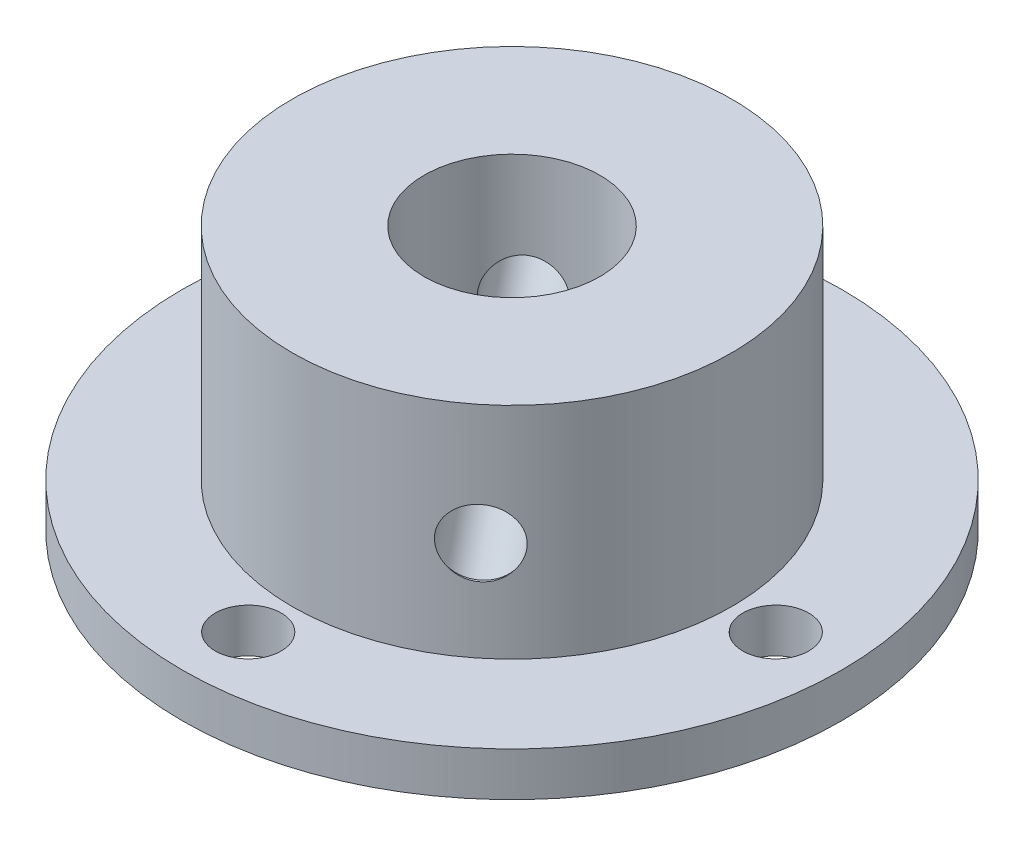
ISO-10303-21;
HEADER;
FILE_DESCRIPTION(('STEP AP214'),'2;1');
FILE_NAME('part.step','',(''),(''),'','','');
FILE_SCHEMA(('AUTOMOTIVE_DESIGN { 1 0 10303 214 1 1 1 1 }'));
ENDSEC;
DATA;
#1=APPLICATION_CONTEXT('core data for automotive mechanical design processes');
#2=APPLICATION_PROTOCOL_DEFINITION('international standard','automotive_design',2000,#1);
#3=PRODUCT_CONTEXT('',#1,'mechanical');
#4=PRODUCT('Part','Part','',(#3));
#5=PRODUCT_RELATED_PRODUCT_CATEGORY('part','',(#4));
#6=PRODUCT_DEFINITION_FORMATION('','',#4);
#7=PRODUCT_DEFINITION_CONTEXT('part definition',#1,'design');
#8=PRODUCT_DEFINITION('design','',#6,#7);
#9=PRODUCT_DEFINITION_SHAPE('','',#8);
#10=(LENGTH_UNIT() NAMED_UNIT(*) SI_UNIT(.MILLI.,.METRE.));
#11=(NAMED_UNIT(*) PLANE_ANGLE_UNIT() SI_UNIT($,.RADIAN.));
#12=(NAMED_UNIT(*) SI_UNIT($,.STERADIAN.) SOLID_ANGLE_UNIT());
#13=UNCERTAINTY_MEASURE_WITH_UNIT(LENGTH_MEASURE(1.E-05),#10,'distance_accuracy_value','');
#14=(GEOMETRIC_REPRESENTATION_CONTEXT(3) GLOBAL_UNCERTAINTY_ASSIGNED_CONTEXT((#13)) GLOBAL_UNIT_ASSIGNED_CONTEXT((#10,
#11,#12)) REPRESENTATION_CONTEXT('',''));
#15=CARTESIAN_POINT('',(0.,0.,0.));
#16=DIRECTION('',(0.,0.,1.));
#17=DIRECTION('',(1.,0.,0.));
#18=AXIS2_PLACEMENT_3D('',#15,#16,#17);
#19=CARTESIAN_POINT('',(0.,12.,0.));
#20=DIRECTION('',(0.,-1.,0.));
#21=DIRECTION('',(0.,0.,-1.));
#22=AXIS2_PLACEMENT_3D('',#19,#20,#21);
#23=CYLINDRICAL_SURFACE('',#22,10.);
#24=CARTESIAN_POINT('',(0.,2.,0.));
#25=DIRECTION('',(0.,1.,0.));
#26=DIRECTION('',(0.,0.,1.));
#27=AXIS2_PLACEMENT_3D('',#24,#25,#26);
#28=CIRCLE('',#27,10.);
#29=CARTESIAN_POINT('',(0.,2.,10.));
#30=VERTEX_POINT('',#29);
#31=EDGE_CURVE('E71',#30,#30,#28,.T.);
#32=ORIENTED_EDGE('',*,*,#31,.T.);
#33=EDGE_LOOP('',(#32));
#34=FACE_BOUND('',#33,.T.);
#35=CARTESIAN_POINT('',(0.,12.,0.));
#36=DIRECTION('',(0.,1.,0.));
#37=DIRECTION('',(0.,0.,1.));
#38=AXIS2_PLACEMENT_3D('',#35,#36,#37);
#39=CIRCLE('',#38,10.);
#40=CARTESIAN_POINT('',(0.,12.,10.));
#41=VERTEX_POINT('',#40);
#42=EDGE_CURVE('E159',#41,#41,#39,.T.);
#43=ORIENTED_EDGE('',*,*,#42,.F.);
#44=EDGE_LOOP('',(#43));
#45=FACE_BOUND('',#44,.T.);
#46=CARTESIAN_POINT('',(-5.08307461118374,6.53635540286175,-8.61175664409645));
#47=CARTESIAN_POINT('',(-5.08307817694966,6.6201009721517,-8.61175554427292));
#48=CARTESIAN_POINT('',(-5.08920908518111,6.70389515361246,-8.60814486953633));
#49=CARTESIAN_POINT('',(-5.11350770711867,6.86914071774488,-8.59373206617742));
#50=CARTESIAN_POINT('',(-5.13168716138509,6.95058973434176,-8.58292292304471));
#51=CARTESIAN_POINT('',(-5.17935967412099,7.10872915830865,-8.5542388362275));
#52=CARTESIAN_POINT('',(-5.2088440497765,7.18542316540391,-8.5363693149893));
#53=CARTESIAN_POINT('',(-5.27801574873614,7.33198243363383,-8.49377371345827));
#54=CARTESIAN_POINT('',(-5.31770166737011,7.40184863307605,-8.46904857709149));
#55=CARTESIAN_POINT('',(-5.40617635215064,7.53333921961609,-8.41284824317796));
#56=CARTESIAN_POINT('',(-5.45502825770332,7.59490101626849,-8.38132598458543));
#57=CARTESIAN_POINT('',(-5.55995514169737,7.70749288851725,-8.31209010424288));
#58=CARTESIAN_POINT('',(-5.61603051702298,7.75852238502874,-8.27437614226643));
#59=CARTESIAN_POINT('',(-5.7338163267514,7.84883203455311,-8.19319734820836));
#60=CARTESIAN_POINT('',(-5.79555254319987,7.88805455318421,-8.14970575366559));
#61=CARTESIAN_POINT('',(-5.92240711349197,7.95326700166993,-8.05799061214833));
#62=CARTESIAN_POINT('',(-5.98752528843069,7.97925763070464,-8.00976731536015));
#63=CARTESIAN_POINT('',(-6.11858051737623,8.01707879139259,-7.91010085779344));
#64=CARTESIAN_POINT('',(-6.18450775809609,8.02901412924891,-7.85868457787018));
#65=CARTESIAN_POINT('',(-6.31566310091543,8.03871133768665,-7.75367361991013));
#66=CARTESIAN_POINT('',(-6.3808912416786,8.03647399618144,-7.70007906313664));
#67=CARTESIAN_POINT('',(-6.50826793812144,8.01797206509932,-7.59271584279589));
#68=CARTESIAN_POINT('',(-6.57043701292343,8.00182023107027,-7.53895203110658));
#69=CARTESIAN_POINT('',(-6.69062787613971,7.95612479653918,-7.43249272246035));
#70=CARTESIAN_POINT('',(-6.74864955776677,7.92658085136031,-7.37979725303614));
#71=CARTESIAN_POINT('',(-6.85936753591646,7.85482440594466,-7.27700563527474));
#72=CARTESIAN_POINT('',(-6.91204287207897,7.81256443775301,-7.22692006601636));
#73=CARTESIAN_POINT('',(-7.01067024132053,7.71661020919177,-7.13128523845485));
#74=CARTESIAN_POINT('',(-7.05662183149915,7.66291519615489,-7.08573627904617));
#75=CARTESIAN_POINT('',(-7.14129629964028,7.54498695403516,-7.000395952245));
#76=CARTESIAN_POINT('',(-7.1799436431866,7.48065528089164,-6.96066561271789));
#77=CARTESIAN_POINT('',(-7.24870285143194,7.34361432573802,-6.8890333132094));
#78=CARTESIAN_POINT('',(-7.27881466356881,7.27090499214183,-6.85713140143595));
#79=CARTESIAN_POINT('',(-7.3299641671711,7.11907143992111,-6.80242866052988));
#80=CARTESIAN_POINT('',(-7.35099477303497,7.03994226919936,-6.77963493908389));
#81=CARTESIAN_POINT('',(-7.38355563650666,6.87757014771436,-6.74415980358345));
#82=CARTESIAN_POINT('',(-7.39508656366732,6.794327487315,-6.73147767684934));
#83=CARTESIAN_POINT('',(-7.40836949807466,6.62695531328427,-6.71685636897489));
#84=CARTESIAN_POINT('',(-7.41021520036589,6.54284221466022,-6.71481425750131));
#85=CARTESIAN_POINT('',(-7.40434623876113,6.37536120804442,-6.72128522795462));
#86=CARTESIAN_POINT('',(-7.3966318715137,6.29199327701099,-6.72979798236446));
#87=CARTESIAN_POINT('',(-7.37184841925341,6.12879558489612,-6.75693586817829));
#88=CARTESIAN_POINT('',(-7.35482636781345,6.04895019792015,-6.7755101523046));
#89=CARTESIAN_POINT('',(-7.31176689133334,5.89457131081315,-6.82195439734634));
#90=CARTESIAN_POINT('',(-7.28572902106105,5.82003807323356,-6.84982481733446));
#91=CARTESIAN_POINT('',(-7.22487676802852,5.67778214252671,-6.91397987589901));
#92=CARTESIAN_POINT('',(-7.18999777800768,5.61011495558194,-6.95032628991888));
#93=CARTESIAN_POINT('',(-7.11220894186605,5.48408254298795,-7.02990557314537));
#94=CARTESIAN_POINT('',(-7.06929864162603,5.4257178436806,-7.0731388317384));
#95=CARTESIAN_POINT('',(-6.97589487664977,5.31945279622817,-7.1652788890458));
#96=CARTESIAN_POINT('',(-6.9253412164699,5.27164367461928,-7.21422995217821));
#97=CARTESIAN_POINT('',(-6.81800544052381,5.18848249759911,-7.31575362208531));
#98=CARTESIAN_POINT('',(-6.76122349520676,5.15313010139673,-7.36832612973747));
#99=CARTESIAN_POINT('',(-6.64299351483298,5.09603166037373,-7.47508878985073));
#100=CARTESIAN_POINT('',(-6.58156352936914,5.0742357357834,-7.52927223426415));
#101=CARTESIAN_POINT('',(-6.45544605324106,5.04470752332428,-7.6376780572068));
#102=CARTESIAN_POINT('',(-6.39075877801112,5.03697430661261,-7.69190043292793));
#103=CARTESIAN_POINT('',(-6.26058583877584,5.03581369831235,-7.79820867084422));
#104=CARTESIAN_POINT('',(-6.19511423058082,5.04224672198478,-7.85031027323895));
#105=CARTESIAN_POINT('',(-6.0646738430679,5.06893679128251,-7.95151229219634));
#106=CARTESIAN_POINT('',(-5.9997050621416,5.08919379267032,-8.00061271836237));
#107=CARTESIAN_POINT('',(-5.87230143312781,5.14290727843199,-8.09458724222939));
#108=CARTESIAN_POINT('',(-5.80986476650116,5.17635409800069,-8.13946440475914));
#109=CARTESIAN_POINT('',(-5.68943388677001,5.2554828908449,-8.22409665284671));
#110=CARTESIAN_POINT('',(-5.63143981797108,5.3011652613421,-8.26385157205111));
#111=CARTESIAN_POINT('',(-5.52125283423965,5.40397310169093,-8.33787867274368));
#112=CARTESIAN_POINT('',(-5.46911926768605,5.4612016286781,-8.37209608115796));
#113=CARTESIAN_POINT('',(-5.37304939014834,5.58526047594223,-8.43407477360833));
#114=CARTESIAN_POINT('',(-5.32911500599916,5.6520930466861,-8.46183454045419));
#115=CARTESIAN_POINT('',(-5.25079932419697,5.79390438609429,-8.5106553449002));
#116=CARTESIAN_POINT('',(-5.21647309486782,5.86892681988358,-8.53167786421394));
#117=CARTESIAN_POINT('',(-5.15902763803963,6.02465217962505,-8.56653796602723));
#118=CARTESIAN_POINT('',(-5.1358967809357,6.10534911071958,-8.58038300546608));
#119=CARTESIAN_POINT('',(-5.10696599017329,6.24473283911823,-8.59762058289235));
#120=CARTESIAN_POINT('',(-5.09802412738678,6.30255879978603,-8.60291802852702));
#121=CARTESIAN_POINT('',(-5.08607722726613,6.4190336945961,-8.60998642154683));
#122=CARTESIAN_POINT('',(-5.08307211298093,6.47768261806137,-8.61175741464121));
#123=CARTESIAN_POINT('',(-5.08307461118374,6.53635540286175,-8.61175664409645));
#124=B_SPLINE_CURVE_WITH_KNOTS('',3,(#46,#47,#48,#49,#50,#51,#52,#53,#54,#55,#56,#57,#58,#59,
#60,#61,#62,#63,#64,#65,#66,#67,#68,#69,#70,#71,#72,#73,#74,#75,#76,#77,#78,#79,#80,#81,#82,#83,
#84,#85,#86,#87,#88,#89,#90,#91,#92,#93,#94,#95,#96,#97,#98,#99,#100,#101,#102,#103,#104,#105,
#106,#107,#108,#109,#110,#111,#112,#113,#114,#115,#116,#117,#118,#119,#120,#121,#122,#123),
.UNSPECIFIED.,.T.,.F.,(4,2,2,2,2,2,2,2,2,2,2,2,2,2,2,2,2,2,2,2,2,2,2,2,2,2,2,2,2,2,2,2,2,2,2,2,
2,2,4),(0.,0.251022251804866,0.502289469561801,0.753364085335673,1.00440414866132,
1.25724158649107,1.51009292207817,1.76415922105782,2.018212093645,2.27035832534396,
2.52249053939373,2.77259862515727,3.02271314839401,3.27377316386453,3.52484970949271,
3.77839544666269,4.03194274514349,4.28568751773138,4.5394144044434,4.79068214603743,
5.04194209099917,5.29194394807373,5.54195815286116,5.79385486001301,6.045765814618,
6.29977537753515,6.55377799071853,6.80684040891089,7.05988611170472,7.31044963622325,
7.56101235892822,7.81139182257832,8.06177941567105,8.31450950010968,8.56729890236861,
8.8215087882493,9.07545403445562,9.25132441891611,9.42719252376191),.UNSPECIFIED.);
#125=CARTESIAN_POINT('',(-5.08307461118374,6.53635540286175,-8.61175664409645));
#126=VERTEX_POINT('',#125);
#127=EDGE_CURVE('E75',#126,#126,#124,.T.);
#128=ORIENTED_EDGE('',*,*,#127,.T.);
#129=EDGE_LOOP('',(#128));
#130=FACE_BOUND('',#129,.T.);
#131=CARTESIAN_POINT('',(7.37151402092131,6.21177102222402,6.75727615532772));
#132=CARTESIAN_POINT('',(7.36507224797421,6.1671708958185,6.76430082265236));
#133=CARTESIAN_POINT('',(7.35729875582511,6.12301460371118,6.77276362068769));
#134=CARTESIAN_POINT('',(7.33910536300391,6.03588264113441,6.7924752633788));
#135=CARTESIAN_POINT('',(7.32868532767352,5.99290703086235,6.8037242497974));
#136=CARTESIAN_POINT('',(7.29351107732418,5.86630160868009,6.84148279595168));
#137=CARTESIAN_POINT('',(7.26482673901222,5.78488177286319,6.87202172024157));
#138=CARTESIAN_POINT('',(7.19900318386284,5.63429087673747,6.94092981271095));
#139=CARTESIAN_POINT('',(7.16230666175433,5.56473166422671,6.97888081043229));
#140=CARTESIAN_POINT('',(7.08039861875751,5.43566173346627,7.06196483258239));
#141=CARTESIAN_POINT('',(7.03519174691422,5.37614556239625,7.10709393366963));
#142=CARTESIAN_POINT('',(6.93801104648648,5.27007289675922,7.20198030703435));
#143=CARTESIAN_POINT('',(6.88617862452998,5.22329606776674,7.25163595602069));
#144=CARTESIAN_POINT('',(6.77621311128364,5.14284642930725,7.35449467666009));
#145=CARTESIAN_POINT('',(6.71808017084464,5.10917330619191,7.4076976633689));
#146=CARTESIAN_POINT('',(6.59902930462944,5.05706788537164,7.51391762530562));
#147=CARTESIAN_POINT('',(6.53827094206705,5.03816081774315,7.56688060511119));
#148=CARTESIAN_POINT('',(6.41389410032711,5.01443411606951,7.67258856933366));
#149=CARTESIAN_POINT('',(6.35027636295317,5.00961084945915,7.725333606458));
#150=CARTESIAN_POINT('',(6.22382270640697,5.01415953822926,7.82754514363739));
#151=CARTESIAN_POINT('',(6.16101312025166,5.02314620075932,7.87706187576541));
#152=CARTESIAN_POINT('',(6.03631970753792,5.05428547156036,7.97301925616255));
#153=CARTESIAN_POINT('',(5.97443589307006,5.07643825162706,8.01945986428463));
#154=CARTESIAN_POINT('',(5.85337737349311,5.13319210484075,8.10824404412226));
#155=CARTESIAN_POINT('',(5.79420625965987,5.167809171534,8.15058226286916));
#156=CARTESIAN_POINT('',(5.68042229280831,5.24837691540968,8.23028766479193));
#157=CARTESIAN_POINT('',(5.62580966496562,5.29432815202344,8.26765460245542));
#158=CARTESIAN_POINT('',(5.52130151859243,5.39762729886884,8.33782387917883));
#159=CARTESIAN_POINT('',(5.4715800152586,5.45525729001235,8.3704698674973));
#160=CARTESIAN_POINT('',(5.38013364614845,5.57941446375165,8.42953937715177));
#161=CARTESIAN_POINT('',(5.33841327300772,5.6459466095237,8.45595940450336));
#162=CARTESIAN_POINT('',(5.26301881656423,5.78840879765301,8.50309835876873));
#163=CARTESIAN_POINT('',(5.22966173776387,5.8645792920444,8.52359621265898));
#164=CARTESIAN_POINT('',(5.17400140708598,6.02225310912178,8.55749840090352));
#165=CARTESIAN_POINT('',(5.15167937696936,6.10374710336987,8.57091478837575));
#166=CARTESIAN_POINT('',(5.13143363745546,6.20584726447395,8.58303007934547));
#167=CARTESIAN_POINT('',(5.12795003711232,6.22507056917282,8.58511158472149));
#168=CARTESIAN_POINT('',(5.12161398141825,6.26363074368991,8.58889311507454));
#169=CARTESIAN_POINT('',(5.11876066251221,6.28296742039137,8.59059366205244));
#170=CARTESIAN_POINT('',(5.11622043488469,6.30236629714364,8.59210617146159));
#171=B_SPLINE_CURVE_WITH_KNOTS('',3,(#131,#132,#133,#134,#135,#136,#137,#138,#139,#140,#141,
#142,#143,#144,#145,#146,#147,#148,#149,#150,#151,#152,#153,#154,#155,#156,#157,#158,#159,#160,
#161,#162,#163,#164,#165,#166,#167,#168,#169,#170),.UNSPECIFIED.,.F.,.F.,(4,2,2,2,2,2,2,2,2,2,2,
2,2,2,2,2,2,2,2,4),(0.,0.136728308521355,0.273463575285128,0.546596945625897,0.807336970783414,
1.06793496970934,1.32368888540488,1.57943667903662,1.82657767271885,2.07365491691284,
2.31396286743847,2.55427395364812,2.79489450031946,3.03552692590381,3.28286979852006,
3.53035115015179,3.78613757575245,4.04148722068463,4.10042057931099,4.15927268488513),.UNSPECIFIED.);
#172=CARTESIAN_POINT('',(7.12959843608751,5.5133519885144,7.01204864074248));
#173=VERTEX_POINT('',#172);
#174=CARTESIAN_POINT('',(5.42880103638817,5.51335198851439,8.39810212532038));
#175=VERTEX_POINT('',#174);
#176=EDGE_CURVE('E46',#173,#175,#171,.T.);
#177=ORIENTED_EDGE('',*,*,#176,.T.);
#178=CARTESIAN_POINT('',(5.42880103638817,5.5133519885144,8.39810212532038));
#179=CARTESIAN_POINT('',(5.40455437345409,5.54412660006345,8.41377581382994));
#180=CARTESIAN_POINT('',(5.38133312870053,5.57609511450647,8.42863805403961));
#181=CARTESIAN_POINT('',(5.33711965861904,5.6422260012992,8.45670380948796));
#182=CARTESIAN_POINT('',(5.31612742456744,5.67638836506203,8.46990733121838));
#183=CARTESIAN_POINT('',(5.25680826814243,5.78179211849057,8.50694688466147));
#184=CARTESIAN_POINT('',(5.22208042619104,5.8560242374061,8.52824932058018));
#185=CARTESIAN_POINT('',(5.1636093791831,6.01030643570974,8.56377944373775));
#186=CARTESIAN_POINT('',(5.13987418035114,6.09036070657628,8.5780019750625));
#187=CARTESIAN_POINT('',(5.10433022576595,6.25397955071941,8.59920024423344));
#188=CARTESIAN_POINT('',(5.09251659779867,6.33754267541051,8.60617894258736));
#189=CARTESIAN_POINT('',(5.08132322243135,6.50515287932747,8.61279266710802));
#190=CARTESIAN_POINT('',(5.08185133013904,6.58919169139258,8.61248211562005));
#191=CARTESIAN_POINT('',(5.09509570895357,6.75599509009079,8.60465321411369));
#192=CARTESIAN_POINT('',(5.10781620244146,6.83875922519734,8.5971323670764));
#193=CARTESIAN_POINT('',(5.14488038588088,7.00035693982344,8.57500240696003));
#194=CARTESIAN_POINT('',(5.16918684011043,7.0792022238199,8.56041599922523));
#195=CARTESIAN_POINT('',(5.2284826171023,7.23102923616871,8.52432777635481));
#196=CARTESIAN_POINT('',(5.26346140221369,7.30401665907357,8.50283278150993));
#197=CARTESIAN_POINT('',(5.32204030836915,7.40603970045645,8.46619061595235));
#198=CARTESIAN_POINT('',(5.34204852123596,7.43812972799815,8.45358718666548));
#199=CARTESIAN_POINT('',(5.38400366387117,7.500283590454,8.42692834298652));
#200=CARTESIAN_POINT('',(5.40594691869819,7.53035108279074,8.4128756726718));
#201=CARTESIAN_POINT('',(5.42880103638817,7.55935881720911,8.39810212532038));
#202=B_SPLINE_CURVE_WITH_KNOTS('',3,(#178,#179,#180,#181,#182,#183,#184,#185,#186,#187,#188,
#189,#190,#191,#192,#193,#194,#195,#196,#197,#198,#199,#200,#201),.UNSPECIFIED.,.F.,.F.,(4,2,2,
2,2,2,2,2,2,2,2,4),(0.,0.126516055318233,0.253031615473632,0.505762052668324,0.758676271585902,
1.01148708534983,1.26241099014472,1.51342182454565,1.76363132789006,2.01359457440514,
2.13307291433863,2.25232904191782),.UNSPECIFIED.);
#203=CARTESIAN_POINT('',(5.42880103638817,7.55935881720911,8.39810212532038));
#204=VERTEX_POINT('',#203);
#205=EDGE_CURVE('E11',#175,#204,#202,.T.);
#206=ORIENTED_EDGE('',*,*,#205,.T.);
#207=CARTESIAN_POINT('',(5.11622043488528,6.77034450858439,8.59210617146124));
#208=CARTESIAN_POINT('',(5.12211825747073,6.81540072090074,8.58859210531326));
#209=CARTESIAN_POINT('',(5.1297151323621,6.86013068517611,8.58406263446365));
#210=CARTESIAN_POINT('',(5.1482331111632,6.9486417098223,8.57297032316172));
#211=CARTESIAN_POINT('',(5.15915432565148,6.99242273857648,8.56640741507042));
#212=CARTESIAN_POINT('',(5.19675874982885,7.12177584439912,8.54368577829247));
#213=CARTESIAN_POINT('',(5.22829920799037,7.20548218821932,8.52448457839325));
#214=CARTESIAN_POINT('',(5.30149399701374,7.36156816300228,8.47914620677171));
#215=CARTESIAN_POINT('',(5.34265222848417,7.43428099319781,8.45334471597856));
#216=CARTESIAN_POINT('',(5.43431693165642,7.57036415345364,8.39470964659487));
#217=CARTESIAN_POINT('',(5.48481895657161,7.63373890191721,8.36187941187712));
#218=CARTESIAN_POINT('',(5.59263157633259,7.74825745987686,8.29015022334916));
#219=CARTESIAN_POINT('',(5.64982522442601,7.79957474051921,8.2513526134717));
#220=CARTESIAN_POINT('',(5.76973081582389,7.88951501331283,8.16795735513158));
#221=CARTESIAN_POINT('',(5.83244266957056,7.92813821143472,8.1233598007936));
#222=CARTESIAN_POINT('',(5.95918199220748,7.99027669783377,8.03082215238099));
#223=CARTESIAN_POINT('',(6.02310324924465,8.01423564057867,7.98303456563596));
#224=CARTESIAN_POINT('',(6.15204645899213,8.04807351300629,7.88409276063233));
#225=CARTESIAN_POINT('',(6.21706810079199,8.05795635479567,7.83293948192167));
#226=CARTESIAN_POINT('',(6.34418286007174,8.0631983023637,7.7303179040092));
#227=CARTESIAN_POINT('',(6.40630476620256,8.05899178999972,7.67890694678792));
#228=CARTESIAN_POINT('',(6.52790000079201,8.03716038463819,7.57580862072402));
#229=CARTESIAN_POINT('',(6.58737338047953,8.01953575129885,7.52412125724944));
#230=CARTESIAN_POINT('',(6.70187526331763,7.97159094301414,7.42231211472478));
#231=CARTESIAN_POINT('',(6.75692243800422,7.94132784062106,7.37218437273448));
#232=CARTESIAN_POINT('',(6.86162858533404,7.86910321722642,7.27483129695408));
#233=CARTESIAN_POINT('',(6.91128739297598,7.82714133812806,7.22760605206274));
#234=CARTESIAN_POINT('',(7.00539755636802,7.73163416806473,7.13644222225128));
#235=CARTESIAN_POINT('',(7.04969190275443,7.67783074634063,7.09261222827385));
#236=CARTESIAN_POINT('',(7.13087962213155,7.56083240083831,7.0109827473806));
#237=CARTESIAN_POINT('',(7.16776882529561,7.49763222042587,6.97318666058863));
#238=CARTESIAN_POINT('',(7.234710693018,7.36130013328074,6.90372174270098));
#239=CARTESIAN_POINT('',(7.26448372583982,7.28790088690899,6.87230916189021));
#240=CARTESIAN_POINT('',(7.31505038737366,7.13506498339439,6.81846090650405));
#241=CARTESIAN_POINT('',(7.33585907338851,7.05563871585349,6.79601018350023));
#242=CARTESIAN_POINT('',(7.35579105414087,6.95563519818943,6.77439042418173));
#243=CARTESIAN_POINT('',(7.35927961583523,6.93680548463156,6.77060008839464));
#244=CARTESIAN_POINT('',(7.36576393116192,6.89899117944672,6.76354534225378));
#245=CARTESIAN_POINT('',(7.36876035776918,6.88000683721534,6.76028021382832));
#246=CARTESIAN_POINT('',(7.37151402092131,6.86093978349948,6.75727615532772));
#247=B_SPLINE_CURVE_WITH_KNOTS('',3,(#207,#208,#209,#210,#211,#212,#213,#214,#215,#216,#217,
#218,#219,#220,#221,#222,#223,#224,#225,#226,#227,#228,#229,#230,#231,#232,#233,#234,#235,#236,
#237,#238,#239,#240,#241,#242,#243,#244,#245,#246),.UNSPECIFIED.,.F.,.F.,(4,2,2,2,2,2,2,2,2,2,2,
2,2,2,2,2,2,2,2,4),(0.,0.136635930580937,0.273276406622499,0.546185474673801,0.807298111335506,
1.06828680054372,1.32525259110117,1.58221421199796,1.83095811397388,2.07963287019045,
2.32071230254015,2.56178706980568,2.8017847706905,3.04178981865485,3.28766302164855,
3.53367428953585,3.7881693740258,4.04223530355552,4.10079285176518,4.15926964589224),.UNSPECIFIED.);
#248=CARTESIAN_POINT('',(7.12959843608751,7.55935881720911,7.01204864074248));
#249=VERTEX_POINT('',#248);
#250=EDGE_CURVE('E70',#204,#249,#247,.T.);
#251=ORIENTED_EDGE('',*,*,#250,.T.);
#252=CARTESIAN_POINT('',(7.12959843608751,7.55935881720911,7.01204864074248));
#253=CARTESIAN_POINT('',(7.14984321607623,7.52858420566005,6.99146432491363));
#254=CARTESIAN_POINT('',(7.16908628908184,7.49661569121704,6.9717205529018));
#255=CARTESIAN_POINT('',(7.20549796785766,7.43048480442431,6.93408138162692));
#256=CARTESIAN_POINT('',(7.2226665817467,7.39632244066148,6.91618597512995));
#257=CARTESIAN_POINT('',(7.27091612763923,7.29091868723293,6.86556313286084));
#258=CARTESIAN_POINT('',(7.29878920973889,7.2166865683174,6.83584936371356));
#259=CARTESIAN_POINT('',(7.34538921609285,7.06240437001377,6.7857525334984));
#260=CARTESIAN_POINT('',(7.36410947466131,6.98235009914722,6.76537627329182));
#261=CARTESIAN_POINT('',(7.39204524745043,6.81873125500409,6.7348421624963));
#262=CARTESIAN_POINT('',(7.40126464460066,6.73516813031299,6.72468013746925));
#263=CARTESIAN_POINT('',(7.41000139476507,6.56755792639603,6.71505193926224));
#264=CARTESIAN_POINT('',(7.40959064752811,6.48351911433093,6.71550650134263));
#265=CARTESIAN_POINT('',(7.39924977887886,6.31671571563271,6.72689823977704));
#266=CARTESIAN_POINT('',(7.38931635964176,6.23395158052616,6.73783904765369));
#267=CARTESIAN_POINT('',(7.36016124538372,6.07235386590006,6.76967406204639));
#268=CARTESIAN_POINT('',(7.34096930364159,5.9935085819036,6.7905363816678));
#269=CARTESIAN_POINT('',(7.29365622961845,5.84168156955479,6.84132833009957));
#270=CARTESIAN_POINT('',(7.26554390405983,5.76869414664993,6.87124901463279));
#271=CARTESIAN_POINT('',(7.21783297096543,5.66667110526705,6.92122704386946));
#272=CARTESIAN_POINT('',(7.20145070262492,5.63458107772535,6.93827979426147));
#273=CARTESIAN_POINT('',(7.16687277507321,5.57242721526951,6.97399106511631));
#274=CARTESIAN_POINT('',(7.14868054517281,5.54235972293277,6.99264654009362));
#275=CARTESIAN_POINT('',(7.12959843608751,5.5133519885144,7.01204864074248));
#276=B_SPLINE_CURVE_WITH_KNOTS('',3,(#252,#253,#254,#255,#256,#257,#258,#259,#260,#261,#262,
#263,#264,#265,#266,#267,#268,#269,#270,#271,#272,#273,#274,#275),.UNSPECIFIED.,.F.,.F.,(4,2,2,
2,2,2,2,2,2,2,2,4),(0.,0.126516055318232,0.253031615473633,0.505762052668325,0.758676271585903,
1.01148708534983,1.26241099014472,1.51342182454566,1.76363132789006,2.01359457440514,
2.13307291433862,2.25232904191781),.UNSPECIFIED.);
#277=EDGE_CURVE('E64',#249,#173,#276,.T.);
#278=ORIENTED_EDGE('',*,*,#277,.T.);
#279=EDGE_LOOP('',(#177,#206,#251,#278));
#280=FACE_BOUND('',#279,.T.);
#281=ADVANCED_FACE('F32',(#34,#45,#130,#280),#23,.T.);
#282=CARTESIAN_POINT('',(0.,2.,0.));
#283=DIRECTION('',(0.,-1.,0.));
#284=DIRECTION('',(0.,0.,-1.));
#285=AXIS2_PLACEMENT_3D('',#282,#283,#284);
#286=CYLINDRICAL_SURFACE('',#285,15.);
#287=CARTESIAN_POINT('',(0.,2.,0.));
#288=DIRECTION('',(0.,1.,0.));
#289=DIRECTION('',(0.,0.,1.));
#290=AXIS2_PLACEMENT_3D('',#287,#288,#289);
#291=CIRCLE('',#290,15.);
#292=CARTESIAN_POINT('',(0.,2.,15.));
#293=VERTEX_POINT('',#292);
#294=EDGE_CURVE('E186',#293,#293,#291,.T.);
#295=ORIENTED_EDGE('',*,*,#294,.F.);
#296=EDGE_LOOP('',(#295));
#297=FACE_BOUND('',#296,.T.);
#298=CARTESIAN_POINT('',(0.,0.,0.));
#299=DIRECTION('',(0.,1.,0.));
#300=DIRECTION('',(0.,0.,1.));
#301=AXIS2_PLACEMENT_3D('',#298,#299,#300);
#302=CIRCLE('',#301,15.);
#303=CARTESIAN_POINT('',(0.,0.,15.));
#304=VERTEX_POINT('',#303);
#305=EDGE_CURVE('E184',#304,#304,#302,.T.);
#306=ORIENTED_EDGE('',*,*,#305,.T.);
#307=EDGE_LOOP('',(#306));
#308=FACE_BOUND('',#307,.T.);
#309=ADVANCED_FACE('F34',(#297,#308),#286,.T.);
#310=CARTESIAN_POINT('',(0.,2.,0.));
#311=DIRECTION('',(0.,1.,0.));
#312=DIRECTION('',(0.,0.,1.));
#313=AXIS2_PLACEMENT_3D('',#310,#311,#312);
#314=PLANE('',#313);
#315=CARTESIAN_POINT('',(-12.,2.,0.));
#316=DIRECTION('',(0.,1.,0.));
#317=DIRECTION('',(0.,0.,1.));
#318=AXIS2_PLACEMENT_3D('',#315,#316,#317);
#319=CIRCLE('',#318,1.5);
#320=CARTESIAN_POINT('',(-12.,2.,1.5));
#321=VERTEX_POINT('',#320);
#322=EDGE_CURVE('E195',#321,#321,#319,.T.);
#323=ORIENTED_EDGE('',*,*,#322,.F.);
#324=EDGE_LOOP('',(#323));
#325=FACE_BOUND('',#324,.T.);
#326=CARTESIAN_POINT('',(0.,2.,-12.));
#327=DIRECTION('',(0.,1.,0.));
#328=DIRECTION('',(0.,0.,1.));
#329=AXIS2_PLACEMENT_3D('',#326,#327,#328);
#330=CIRCLE('',#329,1.5);
#331=CARTESIAN_POINT('',(0.,2.,-10.5));
#332=VERTEX_POINT('',#331);
#333=EDGE_CURVE('E172',#332,#332,#330,.T.);
#334=ORIENTED_EDGE('',*,*,#333,.F.);
#335=EDGE_LOOP('',(#334));
#336=FACE_BOUND('',#335,.T.);
#337=CARTESIAN_POINT('',(12.,2.,0.));
#338=DIRECTION('',(0.,1.,0.));
#339=DIRECTION('',(0.,0.,1.));
#340=AXIS2_PLACEMENT_3D('',#337,#338,#339);
#341=CIRCLE('',#340,1.5);
#342=CARTESIAN_POINT('',(12.,2.,1.50000000000008));
#343=VERTEX_POINT('',#342);
#344=EDGE_CURVE('E167',#343,#343,#341,.T.);
#345=ORIENTED_EDGE('',*,*,#344,.F.);
#346=EDGE_LOOP('',(#345));
#347=FACE_BOUND('',#346,.T.);
#348=CARTESIAN_POINT('',(-1.25958475515353E-13,2.,12.));
#349=DIRECTION('',(0.,1.,0.));
#350=DIRECTION('',(0.,0.,1.));
#351=AXIS2_PLACEMENT_3D('',#348,#349,#350);
#352=CIRCLE('',#351,1.5);
#353=CARTESIAN_POINT('',(-1.25958475515353E-13,2.,13.5));
#354=VERTEX_POINT('',#353);
#355=EDGE_CURVE('E165',#354,#354,#352,.T.);
#356=ORIENTED_EDGE('',*,*,#355,.F.);
#357=EDGE_LOOP('',(#356));
#358=FACE_BOUND('',#357,.T.);
#359=ORIENTED_EDGE('',*,*,#31,.F.);
#360=EDGE_LOOP('',(#359));
#361=FACE_BOUND('',#360,.T.);
#362=ORIENTED_EDGE('',*,*,#294,.T.);
#363=EDGE_LOOP('',(#362));
#364=FACE_BOUND('',#363,.T.);
#365=ADVANCED_FACE('F143',(#325,#336,#347,#358,#361,#364),#314,.T.);
#366=CARTESIAN_POINT('',(0.,0.,0.));
#367=DIRECTION('',(0.,1.,0.));
#368=DIRECTION('',(0.,0.,1.));
#369=AXIS2_PLACEMENT_3D('',#366,#367,#368);
#370=PLANE('',#369);
#371=CARTESIAN_POINT('',(-12.,0.,0.));
#372=DIRECTION('',(0.,1.,0.));
#373=DIRECTION('',(0.,0.,1.));
#374=AXIS2_PLACEMENT_3D('',#371,#372,#373);
#375=CIRCLE('',#374,1.5);
#376=CARTESIAN_POINT('',(-12.,0.,1.5));
#377=VERTEX_POINT('',#376);
#378=EDGE_CURVE('E182',#377,#377,#375,.T.);
#379=ORIENTED_EDGE('',*,*,#378,.T.);
#380=EDGE_LOOP('',(#379));
#381=FACE_BOUND('',#380,.T.);
#382=CARTESIAN_POINT('',(0.,0.,-12.));
#383=DIRECTION('',(0.,1.,0.));
#384=DIRECTION('',(0.,0.,1.));
#385=AXIS2_PLACEMENT_3D('',#382,#383,#384);
#386=CIRCLE('',#385,1.5);
#387=CARTESIAN_POINT('',(0.,0.,-10.5));
#388=VERTEX_POINT('',#387);
#389=EDGE_CURVE('E198',#388,#388,#386,.T.);
#390=ORIENTED_EDGE('',*,*,#389,.T.);
#391=EDGE_LOOP('',(#390));
#392=FACE_BOUND('',#391,.T.);
#393=CARTESIAN_POINT('',(12.,0.,0.));
#394=DIRECTION('',(0.,1.,0.));
#395=DIRECTION('',(0.,0.,1.));
#396=AXIS2_PLACEMENT_3D('',#393,#394,#395);
#397=CIRCLE('',#396,1.5);
#398=CARTESIAN_POINT('',(12.,0.,1.50000000000008));
#399=VERTEX_POINT('',#398);
#400=EDGE_CURVE('E194',#399,#399,#397,.T.);
#401=ORIENTED_EDGE('',*,*,#400,.T.);
#402=EDGE_LOOP('',(#401));
#403=FACE_BOUND('',#402,.T.);
#404=CARTESIAN_POINT('',(-1.25958475515353E-13,0.,12.));
#405=DIRECTION('',(0.,1.,0.));
#406=DIRECTION('',(0.,0.,1.));
#407=AXIS2_PLACEMENT_3D('',#404,#405,#406);
#408=CIRCLE('',#407,1.5);
#409=CARTESIAN_POINT('',(-1.25958475515353E-13,0.,13.5));
#410=VERTEX_POINT('',#409);
#411=EDGE_CURVE('E191',#410,#410,#408,.T.);
#412=ORIENTED_EDGE('',*,*,#411,.T.);
#413=EDGE_LOOP('',(#412));
#414=FACE_BOUND('',#413,.T.);
#415=CARTESIAN_POINT('',(0.,0.,0.));
#416=DIRECTION('',(0.,1.,0.));
#417=DIRECTION('',(0.,0.,1.));
#418=AXIS2_PLACEMENT_3D('',#415,#416,#417);
#419=CIRCLE('',#418,4.);
#420=CARTESIAN_POINT('',(0.,0.,4.));
#421=VERTEX_POINT('',#420);
#422=EDGE_CURVE('E176',#421,#421,#419,.T.);
#423=ORIENTED_EDGE('',*,*,#422,.T.);
#424=EDGE_LOOP('',(#423));
#425=FACE_BOUND('',#424,.T.);
#426=ORIENTED_EDGE('',*,*,#305,.F.);
#427=EDGE_LOOP('',(#426));
#428=FACE_BOUND('',#427,.T.);
#429=ADVANCED_FACE('F138',(#381,#392,#403,#414,#425,#428),#370,.F.);
#430=CARTESIAN_POINT('',(0.,12.,0.));
#431=DIRECTION('',(0.,1.,0.));
#432=DIRECTION('',(0.,0.,1.));
#433=AXIS2_PLACEMENT_3D('',#430,#431,#432);
#434=PLANE('',#433);
#435=CARTESIAN_POINT('',(0.,12.,0.));
#436=DIRECTION('',(0.,1.,0.));
#437=DIRECTION('',(0.,0.,1.));
#438=AXIS2_PLACEMENT_3D('',#435,#436,#437);
#439=CIRCLE('',#438,4.);
#440=CARTESIAN_POINT('',(0.,12.,4.));
#441=VERTEX_POINT('',#440);
#442=EDGE_CURVE('E179',#441,#441,#439,.T.);
#443=ORIENTED_EDGE('',*,*,#442,.F.);
#444=EDGE_LOOP('',(#443));
#445=FACE_BOUND('',#444,.T.);
#446=ORIENTED_EDGE('',*,*,#42,.T.);
#447=EDGE_LOOP('',(#446));
#448=FACE_BOUND('',#447,.T.);
#449=ADVANCED_FACE('F133',(#445,#448),#434,.T.);
#450=CARTESIAN_POINT('',(0.,0.,0.));
#451=DIRECTION('',(0.,1.,0.));
#452=DIRECTION('',(0.,0.,1.));
#453=AXIS2_PLACEMENT_3D('',#450,#451,#452);
#454=CYLINDRICAL_SURFACE('',#453,4.);
#455=CARTESIAN_POINT('',(-1.17974868493663,6.53635540286175,-3.82206659287751));
#456=CARTESIAN_POINT('',(-1.17974453518951,6.45534791914096,-3.82206631464974));
#457=CARTESIAN_POINT('',(-1.18654769573628,6.37436048035812,-3.81998735128193));
#458=CARTESIAN_POINT('',(-1.21330122086096,6.21482731994855,-3.8115737737652));
#459=CARTESIAN_POINT('',(-1.23325119168314,6.13628152526674,-3.80523928707193));
#460=CARTESIAN_POINT('',(-1.28504062103449,5.98398003124823,-3.78806081173573));
#461=CARTESIAN_POINT('',(-1.31685158764315,5.91021334621067,-3.77722762262511));
#462=CARTESIAN_POINT('',(-1.39074791609781,5.76898350604291,-3.75064757069459));
#463=CARTESIAN_POINT('',(-1.4328363638108,5.70152225257923,-3.73489923167969));
#464=CARTESIAN_POINT('',(-1.52758998011978,5.57146509123894,-3.69718529524339));
#465=CARTESIAN_POINT('',(-1.5806471973626,5.50922687323236,-3.67497087399855));
#466=CARTESIAN_POINT('',(-1.6939173122749,5.39463258819027,-3.62415422911169));
#467=CARTESIAN_POINT('',(-1.75413173187232,5.3422786291199,-3.59555064571898));
#468=CARTESIAN_POINT('',(-1.88167828649744,5.24721589056614,-3.53052054951369));
#469=CARTESIAN_POINT('',(-1.94918289829323,5.2048959281459,-3.49386096273721));
#470=CARTESIAN_POINT('',(-2.08694799841249,5.13370423033684,-3.41335608867086));
#471=CARTESIAN_POINT('',(-2.15720752176739,5.10482783086978,-3.36951330065147));
#472=CARTESIAN_POINT('',(-2.2947735460525,5.06259750708714,-3.27728126233643));
#473=CARTESIAN_POINT('',(-2.36207670504267,5.0486277754213,-3.22916968196517));
#474=CARTESIAN_POINT('',(-2.49441788316109,5.03463420191677,-3.12806716436436));
#475=CARTESIAN_POINT('',(-2.55945663197193,5.03460582524305,-3.07507781938046));
#476=CARTESIAN_POINT('',(-2.68208619505578,5.04813716432693,-2.9686168110077));
#477=CARTESIAN_POINT('',(-2.73988629397607,5.06102470081057,-2.91529870701833));
#478=CARTESIAN_POINT('',(-2.85021548218529,5.09889131808731,-2.80752945161388));
#479=CARTESIAN_POINT('',(-2.90274419789803,5.12387125512379,-2.75307822022521));
#480=CARTESIAN_POINT('',(-3.0023451222634,5.1855258545376,-2.64413600653041));
#481=CARTESIAN_POINT('',(-3.04932680472709,5.22236540813016,-2.58965597630722));
#482=CARTESIAN_POINT('',(-3.13646024942436,5.30654749979114,-2.48341395477269));
#483=CARTESIAN_POINT('',(-3.17660980108543,5.35389342587936,-2.43165284691394));
#484=CARTESIAN_POINT('',(-3.25206099523187,5.46098268914494,-2.32988104806945));
#485=CARTESIAN_POINT('',(-3.2869415312787,5.52128931851218,-2.28014997930036));
#486=CARTESIAN_POINT('',(-3.34890126058109,5.65094839618332,-2.18813721446736));
#487=CARTESIAN_POINT('',(-3.37597849501115,5.72030310944839,-2.14585738988656));
#488=CARTESIAN_POINT('',(-3.42295183325026,5.86807487032458,-2.07012976241396));
#489=CARTESIAN_POINT('',(-3.44267520544941,5.94665889654782,-2.03689882386049));
#490=CARTESIAN_POINT('',(-3.47415859815899,6.10945162802933,-1.98272928681859));
#491=CARTESIAN_POINT('',(-3.4859230502299,6.19365717445545,-1.96178384857704));
#492=CARTESIAN_POINT('',(-3.50111241722367,6.36033136517771,-1.93453954078814));
#493=CARTESIAN_POINT('',(-3.50496164187767,6.4426395083979,-1.92749632801378));
#494=CARTESIAN_POINT('',(-3.50560827946343,6.6073647596035,-1.9263211789351));
#495=CARTESIAN_POINT('',(-3.50240745460199,6.68978183521422,-1.93218601617751));
#496=CARTESIAN_POINT('',(-3.48927389065519,6.84828532514943,-1.95579460157912));
#497=CARTESIAN_POINT('',(-3.47966792181063,6.92448653862641,-1.97296125344154));
#498=CARTESIAN_POINT('',(-3.45403343841535,7.07270334758195,-2.01750055600426));
#499=CARTESIAN_POINT('',(-3.43800360798655,7.14471808202989,-2.0448752976725));
#500=CARTESIAN_POINT('',(-3.39873717836117,7.28551984093796,-2.10951718740069));
#501=CARTESIAN_POINT('',(-3.37525296433828,7.35408469499909,-2.1471166782587));
#502=CARTESIAN_POINT('',(-3.32120638949452,7.48348438458779,-2.22980371397001));
#503=CARTESIAN_POINT('',(-3.29064143735388,7.54431637748638,-2.27489399849696));
#504=CARTESIAN_POINT('',(-3.22019098539955,7.66052377605685,-2.37366214230228));
#505=CARTESIAN_POINT('',(-3.17983745995723,7.7153088116305,-2.4277031899274));
#506=CARTESIAN_POINT('',(-3.09112993174111,7.81319377045119,-2.53968726908299));
#507=CARTESIAN_POINT('',(-3.04277590302544,7.85629365580759,-2.59763031326546));
#508=CARTESIAN_POINT('',(-2.93870450649283,7.92930145906136,-2.71479777898756));
#509=CARTESIAN_POINT('',(-2.88301320751843,7.95925452665435,-2.77401707048999));
#510=CARTESIAN_POINT('',(-2.76517890795278,8.00501181671167,-2.89148607060454));
#511=CARTESIAN_POINT('',(-2.70303895462008,8.02082268828415,-2.94973622221234));
#512=CARTESIAN_POINT('',(-2.5777579763535,8.03712980561658,-3.05969037977904));
#513=CARTESIAN_POINT('',(-2.5148863562817,8.03846488592074,-3.11157804505195));
#514=CARTESIAN_POINT('',(-2.38678167392907,8.02794024341635,-3.21089382299888));
#515=CARTESIAN_POINT('',(-2.32154889736957,8.01608211197589,-3.25832247277203));
#516=CARTESIAN_POINT('',(-2.19244603288695,7.98009655136813,-3.34651311042644));
#517=CARTESIAN_POINT('',(-2.1285815244211,7.95627549698339,-3.38740950878705));
#518=CARTESIAN_POINT('',(-2.00262463294336,7.89734538947739,-3.46336677482203));
#519=CARTESIAN_POINT('',(-1.94053258781629,7.862234199557,-3.49842653593201));
#520=CARTESIAN_POINT('',(-1.81752226684378,7.78004145935694,-3.56394078677105));
#521=CARTESIAN_POINT('',(-1.75676305192111,7.7325187623476,-3.59413973529642));
#522=CARTESIAN_POINT('',(-1.64132855195795,7.62754757267415,-3.64830277099235));
#523=CARTESIAN_POINT('',(-1.5866554500334,7.57009553705388,-3.67226462498751));
#524=CARTESIAN_POINT('',(-1.48272173573149,7.44329127121669,-3.71549095291027));
#525=CARTESIAN_POINT('',(-1.43389908706166,7.37347100070744,-3.73444075559261));
#526=CARTESIAN_POINT('',(-1.34749882814653,7.22593953328843,-3.76648089716995));
#527=CARTESIAN_POINT('',(-1.30992238458268,7.14822751880827,-3.77957062821084));
#528=CARTESIAN_POINT('',(-1.24677692474554,6.98339972188635,-3.80088396108199));
#529=CARTESIAN_POINT('',(-1.22180653497811,6.89602103634997,-3.80886907365853));
#530=CARTESIAN_POINT('',(-1.1883001604425,6.71787013090597,-3.81945877051726));
#531=CARTESIAN_POINT('',(-1.17975333349381,6.62710019015176,-3.82206690454896));
#532=CARTESIAN_POINT('',(-1.17974868493663,6.53635540286175,-3.82206659287751));
#533=B_SPLINE_CURVE_WITH_KNOTS('',3,(#455,#456,#457,#458,#459,#460,#461,#462,#463,#464,#465,
#466,#467,#468,#469,#470,#471,#472,#473,#474,#475,#476,#477,#478,#479,#480,#481,#482,#483,#484,
#485,#486,#487,#488,#489,#490,#491,#492,#493,#494,#495,#496,#497,#498,#499,#500,#501,#502,#503,
#504,#505,#506,#507,#508,#509,#510,#511,#512,#513,#514,#515,#516,#517,#518,#519,#520,#521,#522,
#523,#524,#525,#526,#527,#528,#529,#530,#531,#532),.UNSPECIFIED.,.T.,.F.,(4,2,2,2,2,2,2,2,2,2,2,
2,2,2,2,2,2,2,2,2,2,2,2,2,2,2,2,2,2,2,2,2,2,2,2,2,2,2,4),(0.,0.242684541416169,
0.485361814598854,0.727459856757029,0.969630679682932,1.22274652401128,1.47591628822983,
1.73770072136421,1.9993942638133,2.24980018489679,2.50012465404857,2.73806472803194,
2.97602165263335,3.21744131210667,3.45893893628975,3.71456675065874,3.97025867827334,
4.23162592252966,4.49284751635473,4.73965657740484,4.98640395388884,5.22143845928198,
5.45652113429525,5.7004156100582,5.94439948466354,6.20385016993623,6.46330169650177,
6.72185508890167,6.98028685560126,7.22365720549935,7.46699820319478,7.70440274003889,
7.9418522351283,8.18928323676985,8.43680270894963,8.69738599542077,8.95799630544241,
9.23003178870925,9.50188762323052),.UNSPECIFIED.);
#534=CARTESIAN_POINT('',(-1.17974868493663,6.53635540286175,-3.82206659287751));
#535=VERTEX_POINT('',#534);
#536=EDGE_CURVE('E123',#535,#535,#533,.T.);
#537=ORIENTED_EDGE('',*,*,#536,.T.);
#538=EDGE_LOOP('',(#537));
#539=FACE_BOUND('',#538,.T.);
#540=CARTESIAN_POINT('',(3.50530728764292,6.53635540286175,1.92686813747008));
#541=CARTESIAN_POINT('',(3.50530785267299,6.61736288658254,1.92686401696612));
#542=CARTESIAN_POINT('',(3.50189860855702,6.69835032536539,1.93310758458948));
#543=CARTESIAN_POINT('',(3.48825858145184,6.85788348577495,1.95761246275276));
#544=CARTESIAN_POINT('',(3.47802800276605,6.93642928045676,1.97587341336402));
#545=CARTESIAN_POINT('',(3.4507505208036,7.08873077447528,2.02312998946938));
#546=CARTESIAN_POINT('',(3.4337199452642,7.16249745951284,2.05209988901496));
#547=CARTESIAN_POINT('',(3.39277258497392,7.30372729968059,2.11911093441023));
#548=CARTESIAN_POINT('',(3.36885373159429,7.37118855314427,2.1571548046868));
#549=CARTESIAN_POINT('',(3.31279203966372,7.50124571448457,2.24234679669916));
#550=CARTESIAN_POINT('',(3.28032637168643,7.56348393249115,2.28982867972398));
#551=CARTESIAN_POINT('',(3.20769447550458,7.67807821753324,2.39051163750151));
#552=CARTESIAN_POINT('',(3.16752660836488,7.73043217660361,2.4437139284278));
#553=CARTESIAN_POINT('',(3.07809238250459,7.82549491515736,2.55551087048785));
#554=CARTESIAN_POINT('',(3.02856293570053,7.86781487757761,2.61422740832522));
#555=CARTESIAN_POINT('',(2.92191000409976,7.93900657538666,2.732909377218));
#556=CARTESIAN_POINT('',(2.86478916189835,7.96788297485373,2.79287436758382));
#557=CARTESIAN_POINT('',(2.74669057680834,8.01011329863637,2.90899449559399));
#558=CARTESIAN_POINT('',(2.68598546420475,8.02408303030221,2.9652024014406));
#559=CARTESIAN_POINT('',(2.56025346084869,8.03807660380674,3.0744148999152));
#560=CARTESIAN_POINT('',(2.4952279823054,8.03810498048046,3.12742052856838));
#561=CARTESIAN_POINT('',(2.36620782884281,8.02457364139658,3.22603977641773));
#562=CARTESIAN_POINT('',(2.30232131388999,8.01168610491294,3.2718893658968));
#563=CARTESIAN_POINT('',(2.17450238699837,7.9738194876362,3.35819732676722));
#564=CARTESIAN_POINT('',(2.11056997212961,7.94883955059971,3.39865531612929));
#565=CARTESIAN_POINT('',(1.9837674815482,7.8871849511859,3.47421905373874));
#566=CARTESIAN_POINT('',(1.92092640319254,7.85034539759334,3.50923834915336));
#567=CARTESIAN_POINT('',(1.79928481552124,7.76616330593236,3.57313614624654));
#568=CARTESIAN_POINT('',(1.74048561763159,7.71881737984415,3.60201266114852));
#569=CARTESIAN_POINT('',(1.62558005750037,7.61172811657857,3.6553708281813));
#570=CARTESIAN_POINT('',(1.56983255393757,7.55142148721133,3.67949647516423));
#571=CARTESIAN_POINT('',(1.46720814371343,7.42176240954019,3.72161045590207));
#572=CARTESIAN_POINT('',(1.42033346536664,7.35240769627511,3.73959724885824));
#573=CARTESIAN_POINT('',(1.33668372545771,7.20463593539893,3.77032002674572));
#574=CARTESIAN_POINT('',(1.30015592736334,7.12605190917568,3.78293060383116));
#575=CARTESIAN_POINT('',(1.24074693044308,6.96325917769418,3.80283321282518));
#576=CARTESIAN_POINT('',(1.21785813820865,6.87905363126806,3.81012820464887));
#577=CARTESIAN_POINT('',(1.1881088587582,6.7123794405458,3.81950634672216));
#578=CARTESIAN_POINT('',(1.1804337087758,6.63007129732561,3.82185484610892));
#579=CARTESIAN_POINT('',(1.17915223382776,6.46534604612001,3.82225099946556));
#580=CARTESIAN_POINT('',(1.18554239314419,6.38292897050928,3.82029972819168));
#581=CARTESIAN_POINT('',(1.21131585211422,6.22442548057407,3.8122012950513));
#582=CARTESIAN_POINT('',(1.23006798030957,6.14822426709709,3.80625770507944));
#583=CARTESIAN_POINT('',(1.27886445259342,6.00000745814156,3.79013999729057));
#584=CARTESIAN_POINT('',(1.30891111020021,5.92799272369362,3.77996501268916));
#585=CARTESIAN_POINT('',(1.38014777985686,5.78719096478555,3.75455313949204));
#586=CARTESIAN_POINT('',(1.42171327089444,5.71862611072442,3.73914080755106));
#587=CARTESIAN_POINT('',(1.51360677445483,5.58922642113572,3.70289495081593));
#588=CARTESIAN_POINT('',(1.56393799327094,5.52839442823712,3.68205944096936));
#589=CARTESIAN_POINT('',(1.67489242394306,5.41218702966666,3.6329928869275));
#590=CARTESIAN_POINT('',(1.73596581048425,5.357401994093,3.60437674986407));
#591=CARTESIAN_POINT('',(1.86354898371669,5.25951703527232,3.54009616605772));
#592=CARTESIAN_POINT('',(1.9300587880353,5.21641714991592,3.5044316964603));
#593=CARTESIAN_POINT('',(2.06581952751981,5.14340934666214,3.4261495643061));
#594=CARTESIAN_POINT('',(2.13506017681498,5.11345627906915,3.38355639874295));
#595=CARTESIAN_POINT('',(2.2738939749051,5.06769898901184,3.29185544645831));
#596=CARTESIAN_POINT('',(2.34348694255945,5.05188811743936,3.24275073369484));
#597=CARTESIAN_POINT('',(2.47646348808925,5.03558100010693,3.14223964664176));
#598=CARTESIAN_POINT('',(2.53997257252323,5.03424591980276,3.0911342006278));
#599=CARTESIAN_POINT('',(2.66309956484514,5.04477056230715,2.98571040278484));
#600=CARTESIAN_POINT('',(2.72271794111295,5.05662869374761,2.93139243919861));
#601=CARTESIAN_POINT('',(2.83515019638712,5.09261425435538,2.82274564374899));
#602=CARTESIAN_POINT('',(2.8880945937699,5.11643530874011,2.768449404227));
#603=CARTESIAN_POINT('',(2.98791028321201,5.17536541624612,2.66041481293588));
#604=CARTESIAN_POINT('',(3.0347804232844,5.21047660616651,2.60667656876337));
#605=CARTESIAN_POINT('',(3.12377330466715,5.29266934636657,2.49942022539871));
#606=CARTESIAN_POINT('',(3.16561366068842,5.3401920433759,2.44600633864563));
#607=CARTESIAN_POINT('',(3.24195991470207,5.44516323304936,2.34387892941761));
#608=CARTESIAN_POINT('',(3.27646318486288,5.50261526866963,2.29516709441678));
#609=CARTESIAN_POINT('',(3.33977662379543,5.62941953450681,2.20209647152851));
#610=CARTESIAN_POINT('',(3.36819020387233,5.69923980501606,2.15810312530376));
#611=CARTESIAN_POINT('',(3.41700892574431,5.84677127243508,2.07994746135236));
#612=CARTESIAN_POINT('',(3.43741323672608,5.92448328691524,2.04578616361663));
#613=CARTESIAN_POINT('',(3.47103244239807,6.08931108383716,1.98824177843349));
#614=CARTESIAN_POINT('',(3.48389293650794,6.17668976937354,1.96539686479288));
#615=CARTESIAN_POINT('',(3.50102721018252,6.35484067481754,1.93471730352279));
#616=CARTESIAN_POINT('',(3.50530665469482,6.44561061557174,1.92687275326899));
#617=CARTESIAN_POINT('',(3.50530728764292,6.53635540286175,1.92686813747008));
#618=B_SPLINE_CURVE_WITH_KNOTS('',3,(#540,#541,#542,#543,#544,#545,#546,#547,#548,#549,#550,
#551,#552,#553,#554,#555,#556,#557,#558,#559,#560,#561,#562,#563,#564,#565,#566,#567,#568,#569,
#570,#571,#572,#573,#574,#575,#576,#577,#578,#579,#580,#581,#582,#583,#584,#585,#586,#587,#588,
#589,#590,#591,#592,#593,#594,#595,#596,#597,#598,#599,#600,#601,#602,#603,#604,#605,#606,#607,
#608,#609,#610,#611,#612,#613,#614,#615,#616,#617),.UNSPECIFIED.,.T.,.F.,(4,2,2,2,2,2,2,2,2,2,2,
2,2,2,2,2,2,2,2,2,2,2,2,2,2,2,2,2,2,2,2,2,2,2,2,2,2,2,4),(0.,0.242684541416169,
0.485361814598853,0.727459856757029,0.96963067968293,1.22274652401128,1.47591628822983,
1.73770072136421,1.9993942638133,2.24980018489679,2.50012465404857,2.73806472803194,
2.97602165263335,3.21744131210667,3.45893893628975,3.71456675065874,3.97025867827334,
4.23162592252966,4.49284751635473,4.73965657740484,4.98640395388883,5.22143845928197,
5.45652113429525,5.7004156100582,5.94439948466354,6.20385016993623,6.46330169650177,
6.72185508890167,6.98028685560125,7.22365720549935,7.46699820319478,7.70440274003889,
7.9418522351283,8.18928323676985,8.43680270894963,8.69738599542078,8.95799630544241,
9.23003178870925,9.50188762323052),.UNSPECIFIED.);
#619=CARTESIAN_POINT('',(3.50530728764292,6.53635540286175,1.92686813747008));
#620=VERTEX_POINT('',#619);
#621=EDGE_CURVE('E117',#620,#620,#618,.T.);
#622=ORIENTED_EDGE('',*,*,#621,.T.);
#623=EDGE_LOOP('',(#622));
#624=FACE_BOUND('',#623,.T.);
#625=ORIENTED_EDGE('',*,*,#422,.F.);
#626=EDGE_LOOP('',(#625));
#627=FACE_BOUND('',#626,.T.);
#628=ORIENTED_EDGE('',*,*,#442,.T.);
#629=EDGE_LOOP('',(#628));
#630=FACE_BOUND('',#629,.T.);
#631=ADVANCED_FACE('F128',(#539,#624,#627,#630),#454,.F.);
#632=CARTESIAN_POINT('',(-1.25958475515353E-13,-8.,12.));
#633=DIRECTION('',(0.,1.,0.));
#634=DIRECTION('',(0.,0.,1.));
#635=AXIS2_PLACEMENT_3D('',#632,#633,#634);
#636=CYLINDRICAL_SURFACE('',#635,1.5);
#637=ORIENTED_EDGE('',*,*,#355,.T.);
#638=EDGE_LOOP('',(#637));
#639=FACE_BOUND('',#638,.T.);
#640=ORIENTED_EDGE('',*,*,#411,.F.);
#641=EDGE_LOOP('',(#640));
#642=FACE_BOUND('',#641,.T.);
#643=ADVANCED_FACE('F132',(#639,#642),#636,.F.);
#644=CARTESIAN_POINT('',(12.,-8.,0.));
#645=DIRECTION('',(0.,1.,0.));
#646=DIRECTION('',(0.,0.,1.));
#647=AXIS2_PLACEMENT_3D('',#644,#645,#646);
#648=CYLINDRICAL_SURFACE('',#647,1.5);
#649=ORIENTED_EDGE('',*,*,#344,.T.);
#650=EDGE_LOOP('',(#649));
#651=FACE_BOUND('',#650,.T.);
#652=ORIENTED_EDGE('',*,*,#400,.F.);
#653=EDGE_LOOP('',(#652));
#654=FACE_BOUND('',#653,.T.);
#655=ADVANCED_FACE('F210',(#651,#654),#648,.F.);
#656=CARTESIAN_POINT('',(0.,-8.,-12.));
#657=DIRECTION('',(0.,1.,0.));
#658=DIRECTION('',(0.,0.,1.));
#659=AXIS2_PLACEMENT_3D('',#656,#657,#658);
#660=CYLINDRICAL_SURFACE('',#659,1.5);
#661=ORIENTED_EDGE('',*,*,#333,.T.);
#662=EDGE_LOOP('',(#661));
#663=FACE_BOUND('',#662,.T.);
#664=ORIENTED_EDGE('',*,*,#389,.F.);
#665=EDGE_LOOP('',(#664));
#666=FACE_BOUND('',#665,.T.);
#667=ADVANCED_FACE('F205',(#663,#666),#660,.F.);
#668=CARTESIAN_POINT('',(-12.,-8.,0.));
#669=DIRECTION('',(0.,1.,0.));
#670=DIRECTION('',(0.,0.,1.));
#671=AXIS2_PLACEMENT_3D('',#668,#669,#670);
#672=CYLINDRICAL_SURFACE('',#671,1.5);
#673=ORIENTED_EDGE('',*,*,#322,.T.);
#674=EDGE_LOOP('',(#673));
#675=FACE_BOUND('',#674,.T.);
#676=ORIENTED_EDGE('',*,*,#378,.F.);
#677=EDGE_LOOP('',(#676));
#678=FACE_BOUND('',#677,.T.);
#679=ADVANCED_FACE('F104',(#675,#678),#672,.F.);
#680=CARTESIAN_POINT('',(6.31732818469145,6.53635540286175,7.75186200902099));
#681=DIRECTION('',(0.631732818469145,0.,0.775186200902099));
#682=DIRECTION('',(0.775186200902099,0.,-0.631732818469145));
#683=AXIS2_PLACEMENT_3D('',#680,#681,#682);
#684=CYLINDRICAL_SURFACE('',#683,1.5);
#685=ORIENTED_EDGE('',*,*,#127,.F.);
#686=EDGE_LOOP('',(#685));
#687=FACE_BOUND('',#686,.T.);
#688=ORIENTED_EDGE('',*,*,#536,.F.);
#689=EDGE_LOOP('',(#688));
#690=FACE_BOUND('',#689,.T.);
#691=ADVANCED_FACE('F98',(#687,#690),#684,.F.);
#692=CARTESIAN_POINT('',(6.31732818469145,6.53635540286175,7.751862009021));
#693=DIRECTION('',(0.631732818469145,0.,0.775186200902099));
#694=DIRECTION('',(0.775186200902099,0.,-0.631732818469145));
#695=AXIS2_PLACEMENT_3D('',#692,#693,#694);
#696=CONICAL_SURFACE('',#695,1.525,0.392699081698703);
#697=CARTESIAN_POINT('',(6.27919973623784,6.53635540286175,7.70507538303143));
#698=DIRECTION('',(0.631732818469145,0.,0.775186200902099));
#699=DIRECTION('',(0.775186200902099,0.,-0.631732818469145));
#700=AXIS2_PLACEMENT_3D('',#697,#698,#699);
#701=CIRCLE('',#700,1.5);
#702=EDGE_CURVE('E53',#175,#173,#701,.T.);
#703=ORIENTED_EDGE('',*,*,#702,.F.);
#704=ORIENTED_EDGE('',*,*,#176,.F.);
#705=EDGE_LOOP('',(#703,#704));
#706=FACE_BOUND('',#705,.T.);
#707=ADVANCED_FACE('F95',(#706),#696,.F.);
#708=EDGE_CURVE('E68',#249,#204,#701,.T.);
#709=ORIENTED_EDGE('',*,*,#708,.F.);
#710=ORIENTED_EDGE('',*,*,#250,.F.);
#711=EDGE_LOOP('',(#709,#710));
#712=FACE_BOUND('',#711,.T.);
#713=ADVANCED_FACE('F74',(#712),#696,.F.);
#714=ORIENTED_EDGE('',*,*,#702,.T.);
#715=ORIENTED_EDGE('',*,*,#277,.F.);
#716=ORIENTED_EDGE('',*,*,#708,.T.);
#717=ORIENTED_EDGE('',*,*,#205,.F.);
#718=EDGE_LOOP('',(#714,#715,#716,#717));
#719=FACE_BOUND('',#718,.T.);
#720=ORIENTED_EDGE('',*,*,#621,.F.);
#721=EDGE_LOOP('',(#720));
#722=FACE_BOUND('',#721,.T.);
#723=ADVANCED_FACE('F66',(#719,#722),#684,.F.);
#724=CLOSED_SHELL('',(#281,#309,#365,#429,#449,#631,#643,#655,#667,#679,#691,#707,#713,#723));
#725=MANIFOLD_SOLID_BREP('B2',#724);
#726=ADVANCED_BREP_SHAPE_REPRESENTATION('',(#18,#725),#14);
#727=SHAPE_DEFINITION_REPRESENTATION(#9,#726);
ENDSEC;
END-ISO-10303-21;
